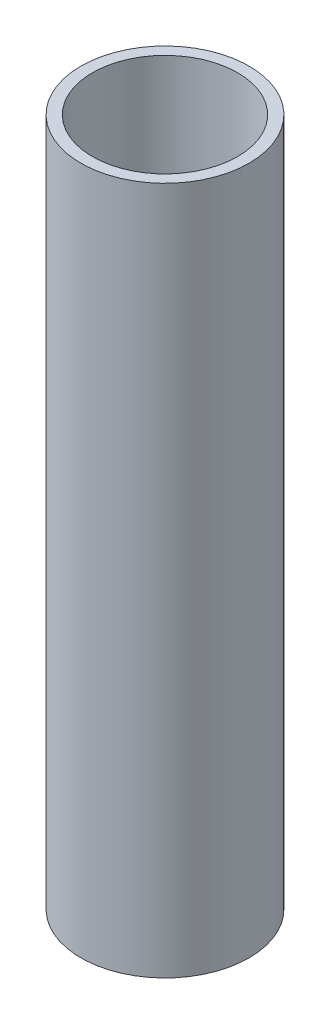
ISO-10303-21;
HEADER;
FILE_DESCRIPTION(('STEP AP214'),'2;1');
FILE_NAME('part.step','',(''),(''),'','','');
FILE_SCHEMA(('AUTOMOTIVE_DESIGN { 1 0 10303 214 1 1 1 1 }'));
ENDSEC;
DATA;
#1=APPLICATION_CONTEXT('core data for automotive mechanical design processes');
#2=APPLICATION_PROTOCOL_DEFINITION('international standard','automotive_design',2000,#1);
#3=PRODUCT_CONTEXT('',#1,'mechanical');
#4=PRODUCT('Part','Part','',(#3));
#5=PRODUCT_RELATED_PRODUCT_CATEGORY('part','',(#4));
#6=PRODUCT_DEFINITION_FORMATION('','',#4);
#7=PRODUCT_DEFINITION_CONTEXT('part definition',#1,'design');
#8=PRODUCT_DEFINITION('design','',#6,#7);
#9=PRODUCT_DEFINITION_SHAPE('','',#8);
#10=(LENGTH_UNIT() NAMED_UNIT(*) SI_UNIT(.MILLI.,.METRE.));
#11=(NAMED_UNIT(*) PLANE_ANGLE_UNIT() SI_UNIT($,.RADIAN.));
#12=(NAMED_UNIT(*) SI_UNIT($,.STERADIAN.) SOLID_ANGLE_UNIT());
#13=UNCERTAINTY_MEASURE_WITH_UNIT(LENGTH_MEASURE(1.E-05),#10,'distance_accuracy_value','');
#14=(GEOMETRIC_REPRESENTATION_CONTEXT(3) GLOBAL_UNCERTAINTY_ASSIGNED_CONTEXT((#13)) GLOBAL_UNIT_ASSIGNED_CONTEXT((#10,
#11,#12)) REPRESENTATION_CONTEXT('',''));
#15=CARTESIAN_POINT('',(0.,0.,0.));
#16=DIRECTION('',(0.,0.,1.));
#17=DIRECTION('',(1.,0.,0.));
#18=AXIS2_PLACEMENT_3D('',#15,#16,#17);
#19=CARTESIAN_POINT('',(0.,45.72,0.));
#20=DIRECTION('',(0.,-1.,0.));
#21=DIRECTION('',(0.,0.,-1.));
#22=AXIS2_PLACEMENT_3D('',#19,#20,#21);
#23=CYLINDRICAL_SURFACE('',#22,4.826);
#24=CARTESIAN_POINT('',(0.,45.72,0.));
#25=DIRECTION('',(0.,1.,0.));
#26=DIRECTION('',(1.,0.,0.));
#27=AXIS2_PLACEMENT_3D('',#24,#25,#26);
#28=CIRCLE('',#27,4.826);
#29=CARTESIAN_POINT('',(4.826,45.72,0.));
#30=VERTEX_POINT('',#29);
#31=EDGE_CURVE('E10',#30,#30,#28,.T.);
#32=ORIENTED_EDGE('',*,*,#31,.T.);
#33=EDGE_LOOP('',(#32));
#34=FACE_BOUND('',#33,.T.);
#35=CARTESIAN_POINT('',(0.,0.,0.));
#36=DIRECTION('',(0.,1.,0.));
#37=DIRECTION('',(1.,0.,0.));
#38=AXIS2_PLACEMENT_3D('',#35,#36,#37);
#39=CIRCLE('',#38,4.826);
#40=CARTESIAN_POINT('',(4.826,0.,0.));
#41=VERTEX_POINT('',#40);
#42=EDGE_CURVE('E28',#41,#41,#39,.T.);
#43=ORIENTED_EDGE('',*,*,#42,.F.);
#44=EDGE_LOOP('',(#43));
#45=FACE_BOUND('',#44,.T.);
#46=ADVANCED_FACE('F14',(#34,#45),#23,.F.);
#47=CARTESIAN_POINT('',(0.,45.72,0.));
#48=DIRECTION('',(0.,-1.,0.));
#49=DIRECTION('',(0.,0.,-1.));
#50=AXIS2_PLACEMENT_3D('',#47,#48,#49);
#51=CYLINDRICAL_SURFACE('',#50,5.588);
#52=CARTESIAN_POINT('',(0.,45.72,0.));
#53=DIRECTION('',(0.,1.,0.));
#54=DIRECTION('',(1.,0.,0.));
#55=AXIS2_PLACEMENT_3D('',#52,#53,#54);
#56=CIRCLE('',#55,5.588);
#57=CARTESIAN_POINT('',(5.588,45.72,0.));
#58=VERTEX_POINT('',#57);
#59=EDGE_CURVE('E26',#58,#58,#56,.T.);
#60=ORIENTED_EDGE('',*,*,#59,.F.);
#61=EDGE_LOOP('',(#60));
#62=FACE_BOUND('',#61,.T.);
#63=CARTESIAN_POINT('',(0.,0.,0.));
#64=DIRECTION('',(0.,1.,0.));
#65=DIRECTION('',(1.,0.,0.));
#66=AXIS2_PLACEMENT_3D('',#63,#64,#65);
#67=CIRCLE('',#66,5.588);
#68=CARTESIAN_POINT('',(5.588,0.,0.));
#69=VERTEX_POINT('',#68);
#70=EDGE_CURVE('E18',#69,#69,#67,.T.);
#71=ORIENTED_EDGE('',*,*,#70,.T.);
#72=EDGE_LOOP('',(#71));
#73=FACE_BOUND('',#72,.T.);
#74=ADVANCED_FACE('F16',(#62,#73),#51,.T.);
#75=CARTESIAN_POINT('',(0.,45.72,0.));
#76=DIRECTION('',(0.,1.,0.));
#77=DIRECTION('',(0.,0.,1.));
#78=AXIS2_PLACEMENT_3D('',#75,#76,#77);
#79=PLANE('',#78);
#80=ORIENTED_EDGE('',*,*,#59,.T.);
#81=EDGE_LOOP('',(#80));
#82=FACE_BOUND('',#81,.T.);
#83=ORIENTED_EDGE('',*,*,#31,.F.);
#84=EDGE_LOOP('',(#83));
#85=FACE_BOUND('',#84,.T.);
#86=ADVANCED_FACE('F33',(#82,#85),#79,.T.);
#87=CARTESIAN_POINT('',(0.,0.,0.));
#88=DIRECTION('',(0.,1.,0.));
#89=DIRECTION('',(0.,0.,1.));
#90=AXIS2_PLACEMENT_3D('',#87,#88,#89);
#91=PLANE('',#90);
#92=ORIENTED_EDGE('',*,*,#70,.F.);
#93=EDGE_LOOP('',(#92));
#94=FACE_BOUND('',#93,.T.);
#95=ORIENTED_EDGE('',*,*,#42,.T.);
#96=EDGE_LOOP('',(#95));
#97=FACE_BOUND('',#96,.T.);
#98=ADVANCED_FACE('F40',(#94,#97),#91,.F.);
#99=CLOSED_SHELL('',(#46,#74,#86,#98));
#100=MANIFOLD_SOLID_BREP('B1',#99);
#101=ADVANCED_BREP_SHAPE_REPRESENTATION('',(#18,#100),#14);
#102=SHAPE_DEFINITION_REPRESENTATION(#9,#101);
ENDSEC;
END-ISO-10303-21;
